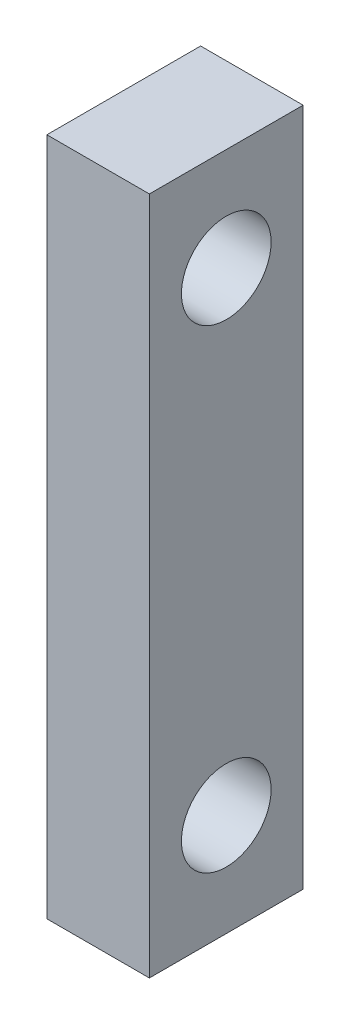
ISO-10303-21;
HEADER;
FILE_DESCRIPTION(('STEP AP214'),'2;1');
FILE_NAME('part.step','',(''),(''),'','','');
FILE_SCHEMA(('AUTOMOTIVE_DESIGN { 1 0 10303 214 1 1 1 1 }'));
ENDSEC;
DATA;
#1=APPLICATION_CONTEXT('core data for automotive mechanical design processes');
#2=APPLICATION_PROTOCOL_DEFINITION('international standard','automotive_design',2000,#1);
#3=PRODUCT_CONTEXT('',#1,'mechanical');
#4=PRODUCT('Part','Part','',(#3));
#5=PRODUCT_RELATED_PRODUCT_CATEGORY('part','',(#4));
#6=PRODUCT_DEFINITION_FORMATION('','',#4);
#7=PRODUCT_DEFINITION_CONTEXT('part definition',#1,'design');
#8=PRODUCT_DEFINITION('design','',#6,#7);
#9=PRODUCT_DEFINITION_SHAPE('','',#8);
#10=(LENGTH_UNIT() NAMED_UNIT(*) SI_UNIT(.MILLI.,.METRE.));
#11=(NAMED_UNIT(*) PLANE_ANGLE_UNIT() SI_UNIT($,.RADIAN.));
#12=(NAMED_UNIT(*) SI_UNIT($,.STERADIAN.) SOLID_ANGLE_UNIT());
#13=UNCERTAINTY_MEASURE_WITH_UNIT(LENGTH_MEASURE(1.E-05),#10,'distance_accuracy_value','');
#14=(GEOMETRIC_REPRESENTATION_CONTEXT(3) GLOBAL_UNCERTAINTY_ASSIGNED_CONTEXT((#13)) GLOBAL_UNIT_ASSIGNED_CONTEXT((#10,
#11,#12)) REPRESENTATION_CONTEXT('',''));
#15=CARTESIAN_POINT('',(0.,0.,0.));
#16=DIRECTION('',(0.,0.,1.));
#17=DIRECTION('',(1.,0.,0.));
#18=AXIS2_PLACEMENT_3D('',#15,#16,#17);
#19=CARTESIAN_POINT('',(8.,26.5,6.));
#20=DIRECTION('',(0.,0.,-1.));
#21=DIRECTION('',(0.,1.,0.));
#22=AXIS2_PLACEMENT_3D('',#19,#20,#21);
#23=PLANE('',#22);
#24=DIRECTION('',(0.,-1.,0.));
#25=VECTOR('',#24,1.);
#26=CARTESIAN_POINT('',(0.,26.5,6.));
#27=LINE('',#26,#25);
#28=CARTESIAN_POINT('',(0.,26.5,6.));
#29=VERTEX_POINT('',#28);
#30=CARTESIAN_POINT('',(0.,-26.5,6.));
#31=VERTEX_POINT('',#30);
#32=EDGE_CURVE('E98',#29,#31,#27,.T.);
#33=ORIENTED_EDGE('',*,*,#32,.T.);
#34=DIRECTION('',(-1.,0.,0.));
#35=VECTOR('',#34,1.);
#36=CARTESIAN_POINT('',(8.,-26.5,6.));
#37=LINE('',#36,#35);
#38=CARTESIAN_POINT('',(8.,-26.5,6.));
#39=VERTEX_POINT('',#38);
#40=EDGE_CURVE('E11',#39,#31,#37,.T.);
#41=ORIENTED_EDGE('',*,*,#40,.F.);
#42=DIRECTION('',(0.,-1.,0.));
#43=VECTOR('',#42,1.);
#44=CARTESIAN_POINT('',(8.,26.5,6.));
#45=LINE('',#44,#43);
#46=CARTESIAN_POINT('',(8.,26.5,6.));
#47=VERTEX_POINT('',#46);
#48=EDGE_CURVE('E86',#47,#39,#45,.T.);
#49=ORIENTED_EDGE('',*,*,#48,.F.);
#50=DIRECTION('',(-1.,0.,0.));
#51=VECTOR('',#50,1.);
#52=CARTESIAN_POINT('',(8.,26.5,6.));
#53=LINE('',#52,#51);
#54=EDGE_CURVE('E94',#47,#29,#53,.T.);
#55=ORIENTED_EDGE('',*,*,#54,.T.);
#56=EDGE_LOOP('',(#33,#41,#49,#55));
#57=FACE_BOUND('',#56,.T.);
#58=ADVANCED_FACE('F35',(#57),#23,.F.);
#59=CARTESIAN_POINT('',(8.,-26.5,-6.));
#60=DIRECTION('',(0.,1.,0.));
#61=DIRECTION('',(0.,0.,1.));
#62=AXIS2_PLACEMENT_3D('',#59,#60,#61);
#63=PLANE('',#62);
#64=DIRECTION('',(0.,0.,-1.));
#65=VECTOR('',#64,1.);
#66=CARTESIAN_POINT('',(0.,-26.5,-6.));
#67=LINE('',#66,#65);
#68=CARTESIAN_POINT('',(0.,-26.5,-6.));
#69=VERTEX_POINT('',#68);
#70=EDGE_CURVE('E90',#31,#69,#67,.T.);
#71=ORIENTED_EDGE('',*,*,#70,.T.);
#72=DIRECTION('',(-1.,0.,0.));
#73=VECTOR('',#72,1.);
#74=CARTESIAN_POINT('',(8.,-26.5,-6.));
#75=LINE('',#74,#73);
#76=CARTESIAN_POINT('',(8.,-26.5,-6.));
#77=VERTEX_POINT('',#76);
#78=EDGE_CURVE('E43',#77,#69,#75,.T.);
#79=ORIENTED_EDGE('',*,*,#78,.F.);
#80=DIRECTION('',(0.,0.,-1.));
#81=VECTOR('',#80,1.);
#82=CARTESIAN_POINT('',(8.,-26.5,-6.));
#83=LINE('',#82,#81);
#84=EDGE_CURVE('E81',#39,#77,#83,.T.);
#85=ORIENTED_EDGE('',*,*,#84,.F.);
#86=ORIENTED_EDGE('',*,*,#40,.T.);
#87=EDGE_LOOP('',(#71,#79,#85,#86));
#88=FACE_BOUND('',#87,.T.);
#89=ADVANCED_FACE('F89',(#88),#63,.F.);
#90=CARTESIAN_POINT('',(8.,26.5,-6.));
#91=DIRECTION('',(0.,0.,1.));
#92=DIRECTION('',(0.,-1.,0.));
#93=AXIS2_PLACEMENT_3D('',#90,#91,#92);
#94=PLANE('',#93);
#95=DIRECTION('',(0.,1.,0.));
#96=VECTOR('',#95,1.);
#97=CARTESIAN_POINT('',(0.,26.5,-6.));
#98=LINE('',#97,#96);
#99=CARTESIAN_POINT('',(0.,26.5,-6.));
#100=VERTEX_POINT('',#99);
#101=EDGE_CURVE('E68',#69,#100,#98,.T.);
#102=ORIENTED_EDGE('',*,*,#101,.T.);
#103=DIRECTION('',(-1.,0.,0.));
#104=VECTOR('',#103,1.);
#105=CARTESIAN_POINT('',(8.,26.5,-6.));
#106=LINE('',#105,#104);
#107=CARTESIAN_POINT('',(8.,26.5,-6.));
#108=VERTEX_POINT('',#107);
#109=EDGE_CURVE('E91',#108,#100,#106,.T.);
#110=ORIENTED_EDGE('',*,*,#109,.F.);
#111=DIRECTION('',(0.,1.,0.));
#112=VECTOR('',#111,1.);
#113=CARTESIAN_POINT('',(8.,26.5,-6.));
#114=LINE('',#113,#112);
#115=EDGE_CURVE('E84',#77,#108,#114,.T.);
#116=ORIENTED_EDGE('',*,*,#115,.F.);
#117=ORIENTED_EDGE('',*,*,#78,.T.);
#118=EDGE_LOOP('',(#102,#110,#116,#117));
#119=FACE_BOUND('',#118,.T.);
#120=ADVANCED_FACE('F92',(#119),#94,.F.);
#121=CARTESIAN_POINT('',(8.,26.5,-6.));
#122=DIRECTION('',(0.,-1.,0.));
#123=DIRECTION('',(0.,0.,-1.));
#124=AXIS2_PLACEMENT_3D('',#121,#122,#123);
#125=PLANE('',#124);
#126=DIRECTION('',(0.,0.,1.));
#127=VECTOR('',#126,1.);
#128=CARTESIAN_POINT('',(0.,26.5,-6.));
#129=LINE('',#128,#127);
#130=EDGE_CURVE('E74',#100,#29,#129,.T.);
#131=ORIENTED_EDGE('',*,*,#130,.T.);
#132=ORIENTED_EDGE('',*,*,#54,.F.);
#133=DIRECTION('',(0.,0.,1.));
#134=VECTOR('',#133,1.);
#135=CARTESIAN_POINT('',(8.,26.5,-6.));
#136=LINE('',#135,#134);
#137=EDGE_CURVE('E51',#108,#47,#136,.T.);
#138=ORIENTED_EDGE('',*,*,#137,.F.);
#139=ORIENTED_EDGE('',*,*,#109,.T.);
#140=EDGE_LOOP('',(#131,#132,#138,#139));
#141=FACE_BOUND('',#140,.T.);
#142=ADVANCED_FACE('F106',(#141),#125,.F.);
#143=CARTESIAN_POINT('',(8.,0.,0.));
#144=DIRECTION('',(-1.,0.,0.));
#145=DIRECTION('',(0.,0.,1.));
#146=AXIS2_PLACEMENT_3D('',#143,#144,#145);
#147=PLANE('',#146);
#148=CARTESIAN_POINT('',(8.,18.5,0.));
#149=DIRECTION('',(1.,0.,0.));
#150=DIRECTION('',(0.,0.,-1.));
#151=AXIS2_PLACEMENT_3D('',#148,#149,#150);
#152=CIRCLE('',#151,3.5);
#153=CARTESIAN_POINT('',(8.,18.5,-3.5));
#154=VERTEX_POINT('',#153);
#155=EDGE_CURVE('E120',#154,#154,#152,.T.);
#156=ORIENTED_EDGE('',*,*,#155,.F.);
#157=EDGE_LOOP('',(#156));
#158=FACE_BOUND('',#157,.T.);
#159=CARTESIAN_POINT('',(8.,-18.5,0.));
#160=DIRECTION('',(1.,0.,0.));
#161=DIRECTION('',(0.,0.,-1.));
#162=AXIS2_PLACEMENT_3D('',#159,#160,#161);
#163=CIRCLE('',#162,3.5);
#164=CARTESIAN_POINT('',(8.,-18.5,-3.5));
#165=VERTEX_POINT('',#164);
#166=EDGE_CURVE('E114',#165,#165,#163,.T.);
#167=ORIENTED_EDGE('',*,*,#166,.F.);
#168=EDGE_LOOP('',(#167));
#169=FACE_BOUND('',#168,.T.);
#170=ORIENTED_EDGE('',*,*,#48,.T.);
#171=ORIENTED_EDGE('',*,*,#84,.T.);
#172=ORIENTED_EDGE('',*,*,#115,.T.);
#173=ORIENTED_EDGE('',*,*,#137,.T.);
#174=EDGE_LOOP('',(#170,#171,#172,#173));
#175=FACE_BOUND('',#174,.T.);
#176=ADVANCED_FACE('F82',(#158,#169,#175),#147,.F.);
#177=CARTESIAN_POINT('',(0.,0.,0.));
#178=DIRECTION('',(-1.,0.,0.));
#179=DIRECTION('',(0.,0.,1.));
#180=AXIS2_PLACEMENT_3D('',#177,#178,#179);
#181=PLANE('',#180);
#182=CARTESIAN_POINT('',(0.,18.5,0.));
#183=DIRECTION('',(1.,0.,0.));
#184=DIRECTION('',(0.,0.,-1.));
#185=AXIS2_PLACEMENT_3D('',#182,#183,#184);
#186=CIRCLE('',#185,3.5);
#187=CARTESIAN_POINT('',(0.,18.5,-3.5));
#188=VERTEX_POINT('',#187);
#189=EDGE_CURVE('E117',#188,#188,#186,.T.);
#190=ORIENTED_EDGE('',*,*,#189,.T.);
#191=EDGE_LOOP('',(#190));
#192=FACE_BOUND('',#191,.T.);
#193=CARTESIAN_POINT('',(0.,-18.5,0.));
#194=DIRECTION('',(1.,0.,0.));
#195=DIRECTION('',(0.,0.,-1.));
#196=AXIS2_PLACEMENT_3D('',#193,#194,#195);
#197=CIRCLE('',#196,3.5);
#198=CARTESIAN_POINT('',(0.,-18.5,-3.5));
#199=VERTEX_POINT('',#198);
#200=EDGE_CURVE('E101',#199,#199,#197,.T.);
#201=ORIENTED_EDGE('',*,*,#200,.T.);
#202=EDGE_LOOP('',(#201));
#203=FACE_BOUND('',#202,.T.);
#204=ORIENTED_EDGE('',*,*,#32,.F.);
#205=ORIENTED_EDGE('',*,*,#130,.F.);
#206=ORIENTED_EDGE('',*,*,#101,.F.);
#207=ORIENTED_EDGE('',*,*,#70,.F.);
#208=EDGE_LOOP('',(#204,#205,#206,#207));
#209=FACE_BOUND('',#208,.T.);
#210=ADVANCED_FACE('F109',(#192,#203,#209),#181,.T.);
#211=CARTESIAN_POINT('',(8.,-18.5,0.));
#212=DIRECTION('',(1.,0.,0.));
#213=DIRECTION('',(0.,0.,-1.));
#214=AXIS2_PLACEMENT_3D('',#211,#212,#213);
#215=CYLINDRICAL_SURFACE('',#214,3.5);
#216=ORIENTED_EDGE('',*,*,#200,.F.);
#217=EDGE_LOOP('',(#216));
#218=FACE_BOUND('',#217,.T.);
#219=ORIENTED_EDGE('',*,*,#166,.T.);
#220=EDGE_LOOP('',(#219));
#221=FACE_BOUND('',#220,.T.);
#222=ADVANCED_FACE('F131',(#218,#221),#215,.F.);
#223=CARTESIAN_POINT('',(8.,18.5,0.));
#224=DIRECTION('',(1.,0.,0.));
#225=DIRECTION('',(0.,0.,-1.));
#226=AXIS2_PLACEMENT_3D('',#223,#224,#225);
#227=CYLINDRICAL_SURFACE('',#226,3.5);
#228=ORIENTED_EDGE('',*,*,#189,.F.);
#229=EDGE_LOOP('',(#228));
#230=FACE_BOUND('',#229,.T.);
#231=ORIENTED_EDGE('',*,*,#155,.T.);
#232=EDGE_LOOP('',(#231));
#233=FACE_BOUND('',#232,.T.);
#234=ADVANCED_FACE('F124',(#230,#233),#227,.F.);
#235=CLOSED_SHELL('',(#58,#89,#120,#142,#176,#210,#222,#234));
#236=MANIFOLD_SOLID_BREP('B2',#235);
#237=ADVANCED_BREP_SHAPE_REPRESENTATION('',(#18,#236),#14);
#238=SHAPE_DEFINITION_REPRESENTATION(#9,#237);
ENDSEC;
END-ISO-10303-21;
